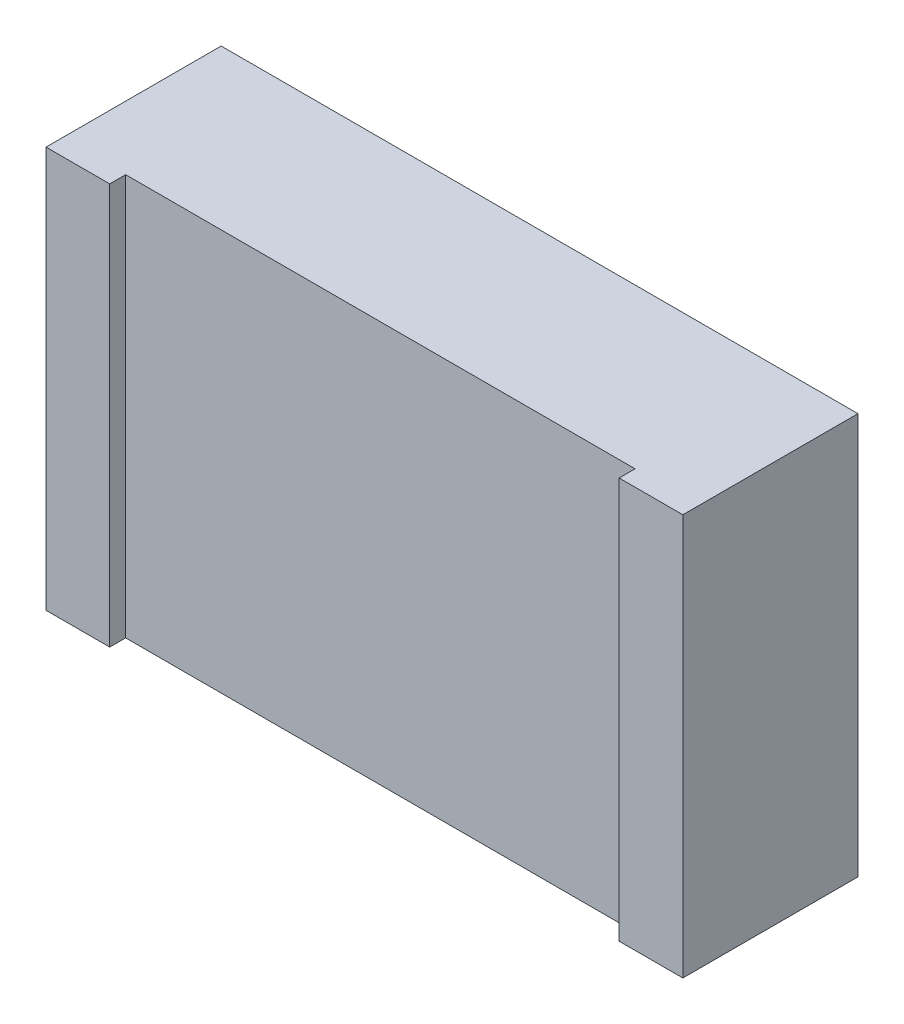
ISO-10303-21;
HEADER;
FILE_DESCRIPTION(('STEP AP214'),'2;1');
FILE_NAME('part.step','',(''),(''),'','','');
FILE_SCHEMA(('AUTOMOTIVE_DESIGN { 1 0 10303 214 1 1 1 1 }'));
ENDSEC;
DATA;
#1=APPLICATION_CONTEXT('core data for automotive mechanical design processes');
#2=APPLICATION_PROTOCOL_DEFINITION('international standard','automotive_design',2000,#1);
#3=PRODUCT_CONTEXT('',#1,'mechanical');
#4=PRODUCT('Part','Part','',(#3));
#5=PRODUCT_RELATED_PRODUCT_CATEGORY('part','',(#4));
#6=PRODUCT_DEFINITION_FORMATION('','',#4);
#7=PRODUCT_DEFINITION_CONTEXT('part definition',#1,'design');
#8=PRODUCT_DEFINITION('design','',#6,#7);
#9=PRODUCT_DEFINITION_SHAPE('','',#8);
#10=(LENGTH_UNIT() NAMED_UNIT(*) SI_UNIT(.MILLI.,.METRE.));
#11=(NAMED_UNIT(*) PLANE_ANGLE_UNIT() SI_UNIT($,.RADIAN.));
#12=(NAMED_UNIT(*) SI_UNIT($,.STERADIAN.) SOLID_ANGLE_UNIT());
#13=UNCERTAINTY_MEASURE_WITH_UNIT(LENGTH_MEASURE(1.E-05),#10,'distance_accuracy_value','');
#14=(GEOMETRIC_REPRESENTATION_CONTEXT(3) GLOBAL_UNCERTAINTY_ASSIGNED_CONTEXT((#13)) GLOBAL_UNIT_ASSIGNED_CONTEXT((#10,
#11,#12)) REPRESENTATION_CONTEXT('',''));
#15=CARTESIAN_POINT('',(0.,0.,0.));
#16=DIRECTION('',(0.,0.,1.));
#17=DIRECTION('',(1.,0.,0.));
#18=AXIS2_PLACEMENT_3D('',#15,#16,#17);
#19=CARTESIAN_POINT('',(35.721729900549,24.912354863751,0.55));
#20=DIRECTION('',(0.,0.,1.));
#21=DIRECTION('',(1.,0.,0.));
#22=AXIS2_PLACEMENT_3D('',#19,#20,#21);
#23=PLANE('',#22);
#24=DIRECTION('',(-8.74227769999996E-08,1.,0.));
#25=VECTOR('',#24,1.);
#26=CARTESIAN_POINT('',(33.921730010701,23.65235470639,0.55));
#27=LINE('',#26,#25);
#28=CARTESIAN_POINT('',(33.921730010701,23.65235470639,0.55));
#29=VERTEX_POINT('',#28);
#30=CARTESIAN_POINT('',(33.921729900549,24.91235470639,0.55));
#31=VERTEX_POINT('',#30);
#32=EDGE_CURVE('E11',#29,#31,#27,.T.);
#33=ORIENTED_EDGE('',*,*,#32,.T.);
#34=DIRECTION('',(1.,8.74227769999996E-08,0.));
#35=VECTOR('',#34,1.);
#36=CARTESIAN_POINT('',(33.721729900549,24.912354688905,0.55));
#37=LINE('',#36,#35);
#38=CARTESIAN_POINT('',(33.721729900549,24.912354688905,0.55));
#39=VERTEX_POINT('',#38);
#40=EDGE_CURVE('E167',#39,#31,#37,.T.);
#41=ORIENTED_EDGE('',*,*,#40,.F.);
#42=DIRECTION('',(-8.74227769999996E-08,1.,0.));
#43=VECTOR('',#42,1.);
#44=CARTESIAN_POINT('',(33.721730010701,23.652354688905,0.55));
#45=LINE('',#44,#43);
#46=CARTESIAN_POINT('',(33.721730010701,23.652354688905,0.55));
#47=VERTEX_POINT('',#46);
#48=EDGE_CURVE('E168',#47,#39,#45,.T.);
#49=ORIENTED_EDGE('',*,*,#48,.F.);
#50=DIRECTION('',(-1.,-8.74227769999996E-08,0.));
#51=VECTOR('',#50,1.);
#52=CARTESIAN_POINT('',(33.921730010701,23.65235470639,0.55));
#53=LINE('',#52,#51);
#54=EDGE_CURVE('E197',#29,#47,#53,.T.);
#55=ORIENTED_EDGE('',*,*,#54,.F.);
#56=EDGE_LOOP('',(#33,#41,#49,#55));
#57=FACE_BOUND('',#56,.T.);
#58=ADVANCED_FACE('F17',(#57),#23,.T.);
#59=CARTESIAN_POINT('',(33.921730010701,23.65235470639,0.5));
#60=DIRECTION('',(-1.,-8.74227771720996E-08,0.));
#61=DIRECTION('',(-8.74227771720996E-08,1.,0.));
#62=AXIS2_PLACEMENT_3D('',#59,#60,#61);
#63=PLANE('',#62);
#64=ORIENTED_EDGE('',*,*,#32,.F.);
#65=DIRECTION('',(0.,0.,-1.));
#66=VECTOR('',#65,1.);
#67=CARTESIAN_POINT('',(33.921730010701,23.65235470639,0.55));
#68=LINE('',#67,#66);
#69=CARTESIAN_POINT('',(33.921730010701,23.65235470639,0.5));
#70=VERTEX_POINT('',#69);
#71=EDGE_CURVE('E111',#29,#70,#68,.T.);
#72=ORIENTED_EDGE('',*,*,#71,.T.);
#73=DIRECTION('',(-8.74227771762296E-08,1.,0.));
#74=VECTOR('',#73,1.);
#75=CARTESIAN_POINT('',(33.921730010701,23.65235470639,0.5));
#76=LINE('',#75,#74);
#77=CARTESIAN_POINT('',(33.921729900549,24.91235470639,0.5));
#78=VERTEX_POINT('',#77);
#79=EDGE_CURVE('E169',#70,#78,#76,.T.);
#80=ORIENTED_EDGE('',*,*,#79,.T.);
#81=DIRECTION('',(0.,0.,-1.));
#82=VECTOR('',#81,1.);
#83=CARTESIAN_POINT('',(33.921729900549,24.91235470639,0.55));
#84=LINE('',#83,#82);
#85=EDGE_CURVE('E27',#31,#78,#84,.T.);
#86=ORIENTED_EDGE('',*,*,#85,.F.);
#87=EDGE_LOOP('',(#64,#72,#80,#86));
#88=FACE_BOUND('',#87,.T.);
#89=ADVANCED_FACE('F295',(#88),#63,.F.);
#90=CARTESIAN_POINT('',(35.721729900549,24.912354863751,0.55));
#91=DIRECTION('',(8.74227769999996E-08,-1.,0.));
#92=DIRECTION('',(0.,0.,-1.));
#93=AXIS2_PLACEMENT_3D('',#90,#91,#92);
#94=PLANE('',#93);
#95=ORIENTED_EDGE('',*,*,#40,.T.);
#96=ORIENTED_EDGE('',*,*,#85,.T.);
#97=DIRECTION('',(1.,8.74227769999996E-08,0.));
#98=VECTOR('',#97,1.);
#99=CARTESIAN_POINT('',(33.921729900549,24.91235470639,0.5));
#100=LINE('',#99,#98);
#101=CARTESIAN_POINT('',(35.521729900549,24.912354846266,0.5));
#102=VERTEX_POINT('',#101);
#103=EDGE_CURVE('E177',#78,#102,#100,.T.);
#104=ORIENTED_EDGE('',*,*,#103,.T.);
#105=DIRECTION('',(0.,0.,-1.));
#106=VECTOR('',#105,1.);
#107=CARTESIAN_POINT('',(35.521729900549,24.912354846266,0.55));
#108=LINE('',#107,#106);
#109=CARTESIAN_POINT('',(35.521729900549,24.912354846266,0.55));
#110=VERTEX_POINT('',#109);
#111=EDGE_CURVE('E159',#110,#102,#108,.T.);
#112=ORIENTED_EDGE('',*,*,#111,.F.);
#113=DIRECTION('',(1.,8.74227769999996E-08,0.));
#114=VECTOR('',#113,1.);
#115=CARTESIAN_POINT('',(35.521729900549,24.912354846266,0.55));
#116=LINE('',#115,#114);
#117=CARTESIAN_POINT('',(35.721729900549,24.912354863751,0.55));
#118=VERTEX_POINT('',#117);
#119=EDGE_CURVE('E145',#110,#118,#116,.T.);
#120=ORIENTED_EDGE('',*,*,#119,.T.);
#121=DIRECTION('',(0.,0.,1.));
#122=VECTOR('',#121,1.);
#123=CARTESIAN_POINT('',(35.721729900549,24.912354863751,0.));
#124=LINE('',#123,#122);
#125=CARTESIAN_POINT('',(35.721729900549,24.912354863751,0.));
#126=VERTEX_POINT('',#125);
#127=EDGE_CURVE('E140',#126,#118,#124,.T.);
#128=ORIENTED_EDGE('',*,*,#127,.F.);
#129=DIRECTION('',(1.,8.74227769999996E-08,0.));
#130=VECTOR('',#129,1.);
#131=CARTESIAN_POINT('',(33.721729900549,24.912354688905,0.));
#132=LINE('',#131,#130);
#133=CARTESIAN_POINT('',(33.721729900549,24.912354688905,0.));
#134=VERTEX_POINT('',#133);
#135=EDGE_CURVE('E82',#134,#126,#132,.T.);
#136=ORIENTED_EDGE('',*,*,#135,.F.);
#137=DIRECTION('',(0.,0.,1.));
#138=VECTOR('',#137,1.);
#139=CARTESIAN_POINT('',(33.721729900549,24.912354688905,0.));
#140=LINE('',#139,#138);
#141=EDGE_CURVE('E164',#134,#39,#140,.T.);
#142=ORIENTED_EDGE('',*,*,#141,.T.);
#143=EDGE_LOOP('',(#95,#96,#104,#112,#120,#128,#136,#142));
#144=FACE_BOUND('',#143,.T.);
#145=ADVANCED_FACE('F285',(#144),#94,.F.);
#146=CARTESIAN_POINT('',(33.721730010701,23.652354688905,0.55));
#147=DIRECTION('',(1.,8.74227769999996E-08,0.));
#148=DIRECTION('',(0.,0.,-1.));
#149=AXIS2_PLACEMENT_3D('',#146,#147,#148);
#150=PLANE('',#149);
#151=DIRECTION('',(-8.74227769999996E-08,1.,0.));
#152=VECTOR('',#151,1.);
#153=CARTESIAN_POINT('',(33.721730010701,23.652354688905,0.));
#154=LINE('',#153,#152);
#155=CARTESIAN_POINT('',(33.721730010701,23.652354688905,0.));
#156=VERTEX_POINT('',#155);
#157=EDGE_CURVE('E189',#156,#134,#154,.T.);
#158=ORIENTED_EDGE('',*,*,#157,.F.);
#159=DIRECTION('',(0.,0.,1.));
#160=VECTOR('',#159,1.);
#161=CARTESIAN_POINT('',(33.721730010701,23.652354688905,0.));
#162=LINE('',#161,#160);
#163=EDGE_CURVE('E163',#156,#47,#162,.T.);
#164=ORIENTED_EDGE('',*,*,#163,.T.);
#165=ORIENTED_EDGE('',*,*,#48,.T.);
#166=ORIENTED_EDGE('',*,*,#141,.F.);
#167=EDGE_LOOP('',(#158,#164,#165,#166));
#168=FACE_BOUND('',#167,.T.);
#169=ADVANCED_FACE('F275',(#168),#150,.F.);
#170=CARTESIAN_POINT('',(35.721729900549,24.912354863751,0.));
#171=DIRECTION('',(0.,0.,1.));
#172=DIRECTION('',(1.,0.,0.));
#173=AXIS2_PLACEMENT_3D('',#170,#171,#172);
#174=PLANE('',#173);
#175=DIRECTION('',(8.74227769999996E-08,-1.,0.));
#176=VECTOR('',#175,1.);
#177=CARTESIAN_POINT('',(35.721729900549,24.912354863751,0.));
#178=LINE('',#177,#176);
#179=CARTESIAN_POINT('',(35.721730010701,23.652354863751,0.));
#180=VERTEX_POINT('',#179);
#181=EDGE_CURVE('E92',#126,#180,#178,.T.);
#182=ORIENTED_EDGE('',*,*,#181,.T.);
#183=DIRECTION('',(-1.,-8.74227769999996E-08,0.));
#184=VECTOR('',#183,1.);
#185=CARTESIAN_POINT('',(35.721730010701,23.652354863751,0.));
#186=LINE('',#185,#184);
#187=EDGE_CURVE('E133',#180,#156,#186,.T.);
#188=ORIENTED_EDGE('',*,*,#187,.T.);
#189=ORIENTED_EDGE('',*,*,#157,.T.);
#190=ORIENTED_EDGE('',*,*,#135,.T.);
#191=EDGE_LOOP('',(#182,#188,#189,#190));
#192=FACE_BOUND('',#191,.T.);
#193=ADVANCED_FACE('F265',(#192),#174,.F.);
#194=CARTESIAN_POINT('',(35.721730010701,23.652354863751,0.55));
#195=DIRECTION('',(-1.,-8.74227769999996E-08,0.));
#196=DIRECTION('',(-8.74227769999996E-08,1.,0.));
#197=AXIS2_PLACEMENT_3D('',#194,#195,#196);
#198=PLANE('',#197);
#199=ORIENTED_EDGE('',*,*,#181,.F.);
#200=ORIENTED_EDGE('',*,*,#127,.T.);
#201=DIRECTION('',(8.74227769999996E-08,-1.,0.));
#202=VECTOR('',#201,1.);
#203=CARTESIAN_POINT('',(35.721729900549,24.912354863751,0.55));
#204=LINE('',#203,#202);
#205=CARTESIAN_POINT('',(35.721730010701,23.652354863751,0.55));
#206=VERTEX_POINT('',#205);
#207=EDGE_CURVE('E138',#118,#206,#204,.T.);
#208=ORIENTED_EDGE('',*,*,#207,.T.);
#209=DIRECTION('',(0.,0.,1.));
#210=VECTOR('',#209,1.);
#211=CARTESIAN_POINT('',(35.721730010701,23.652354863751,0.));
#212=LINE('',#211,#210);
#213=EDGE_CURVE('E126',#180,#206,#212,.T.);
#214=ORIENTED_EDGE('',*,*,#213,.F.);
#215=EDGE_LOOP('',(#199,#200,#208,#214));
#216=FACE_BOUND('',#215,.T.);
#217=ADVANCED_FACE('F139',(#216),#198,.F.);
#218=CARTESIAN_POINT('',(35.721730010701,23.652354863751,0.55));
#219=DIRECTION('',(-8.74227769999996E-08,1.,0.));
#220=DIRECTION('',(0.,0.,1.));
#221=AXIS2_PLACEMENT_3D('',#218,#219,#220);
#222=PLANE('',#221);
#223=DIRECTION('',(-1.,-8.74227769999996E-08,0.));
#224=VECTOR('',#223,1.);
#225=CARTESIAN_POINT('',(35.521730010701,23.652354846266,0.5));
#226=LINE('',#225,#224);
#227=CARTESIAN_POINT('',(35.521730010701,23.652354846266,0.5));
#228=VERTEX_POINT('',#227);
#229=EDGE_CURVE('E171',#228,#70,#226,.T.);
#230=ORIENTED_EDGE('',*,*,#229,.T.);
#231=ORIENTED_EDGE('',*,*,#71,.F.);
#232=ORIENTED_EDGE('',*,*,#54,.T.);
#233=ORIENTED_EDGE('',*,*,#163,.F.);
#234=ORIENTED_EDGE('',*,*,#187,.F.);
#235=ORIENTED_EDGE('',*,*,#213,.T.);
#236=DIRECTION('',(-1.,-8.74227769999996E-08,0.));
#237=VECTOR('',#236,1.);
#238=CARTESIAN_POINT('',(35.721730010701,23.652354863751,0.55));
#239=LINE('',#238,#237);
#240=CARTESIAN_POINT('',(35.521730010701,23.652354846266,0.55));
#241=VERTEX_POINT('',#240);
#242=EDGE_CURVE('E130',#206,#241,#239,.T.);
#243=ORIENTED_EDGE('',*,*,#242,.T.);
#244=DIRECTION('',(0.,0.,-1.));
#245=VECTOR('',#244,1.);
#246=CARTESIAN_POINT('',(35.521730010701,23.652354846266,0.55));
#247=LINE('',#246,#245);
#248=EDGE_CURVE('E119',#241,#228,#247,.T.);
#249=ORIENTED_EDGE('',*,*,#248,.T.);
#250=EDGE_LOOP('',(#230,#231,#232,#233,#234,#235,#243,#249));
#251=FACE_BOUND('',#250,.T.);
#252=ADVANCED_FACE('F128',(#251),#222,.F.);
#253=CARTESIAN_POINT('',(33.921729900549,24.91235470639,0.5));
#254=DIRECTION('',(0.,0.,1.));
#255=DIRECTION('',(1.,0.,0.));
#256=AXIS2_PLACEMENT_3D('',#253,#254,#255);
#257=PLANE('',#256);
#258=ORIENTED_EDGE('',*,*,#79,.F.);
#259=ORIENTED_EDGE('',*,*,#229,.F.);
#260=DIRECTION('',(8.74227770881096E-08,-1.,0.));
#261=VECTOR('',#260,1.);
#262=CARTESIAN_POINT('',(35.521729900549,24.912354846266,0.5));
#263=LINE('',#262,#261);
#264=EDGE_CURVE('E157',#102,#228,#263,.T.);
#265=ORIENTED_EDGE('',*,*,#264,.F.);
#266=ORIENTED_EDGE('',*,*,#103,.F.);
#267=EDGE_LOOP('',(#258,#259,#265,#266));
#268=FACE_BOUND('',#267,.T.);
#269=ADVANCED_FACE('F236',(#268),#257,.T.);
#270=CARTESIAN_POINT('',(35.521730010701,23.652354846266,0.5));
#271=DIRECTION('',(1.,8.74227770860497E-08,0.));
#272=DIRECTION('',(0.,0.,-1.));
#273=AXIS2_PLACEMENT_3D('',#270,#271,#272);
#274=PLANE('',#273);
#275=DIRECTION('',(8.74227769999996E-08,-1.,0.));
#276=VECTOR('',#275,1.);
#277=CARTESIAN_POINT('',(35.521729900549,24.912354846266,0.55));
#278=LINE('',#277,#276);
#279=EDGE_CURVE('E20',#110,#241,#278,.T.);
#280=ORIENTED_EDGE('',*,*,#279,.F.);
#281=ORIENTED_EDGE('',*,*,#111,.T.);
#282=ORIENTED_EDGE('',*,*,#264,.T.);
#283=ORIENTED_EDGE('',*,*,#248,.F.);
#284=EDGE_LOOP('',(#280,#281,#282,#283));
#285=FACE_BOUND('',#284,.T.);
#286=ADVANCED_FACE('F222',(#285),#274,.F.);
#287=CARTESIAN_POINT('',(35.721729900549,24.912354863751,0.55));
#288=DIRECTION('',(0.,0.,1.));
#289=DIRECTION('',(1.,0.,0.));
#290=AXIS2_PLACEMENT_3D('',#287,#288,#289);
#291=PLANE('',#290);
#292=ORIENTED_EDGE('',*,*,#279,.T.);
#293=ORIENTED_EDGE('',*,*,#242,.F.);
#294=ORIENTED_EDGE('',*,*,#207,.F.);
#295=ORIENTED_EDGE('',*,*,#119,.F.);
#296=EDGE_LOOP('',(#292,#293,#294,#295));
#297=FACE_BOUND('',#296,.T.);
#298=ADVANCED_FACE('F147',(#297),#291,.T.);
#299=CLOSED_SHELL('',(#58,#89,#145,#169,#193,#217,#252,#269,#286,#298));
#300=MANIFOLD_SOLID_BREP('B1',#299);
#301=ADVANCED_BREP_SHAPE_REPRESENTATION('',(#18,#300),#14);
#302=SHAPE_DEFINITION_REPRESENTATION(#9,#301);
ENDSEC;
END-ISO-10303-21;
